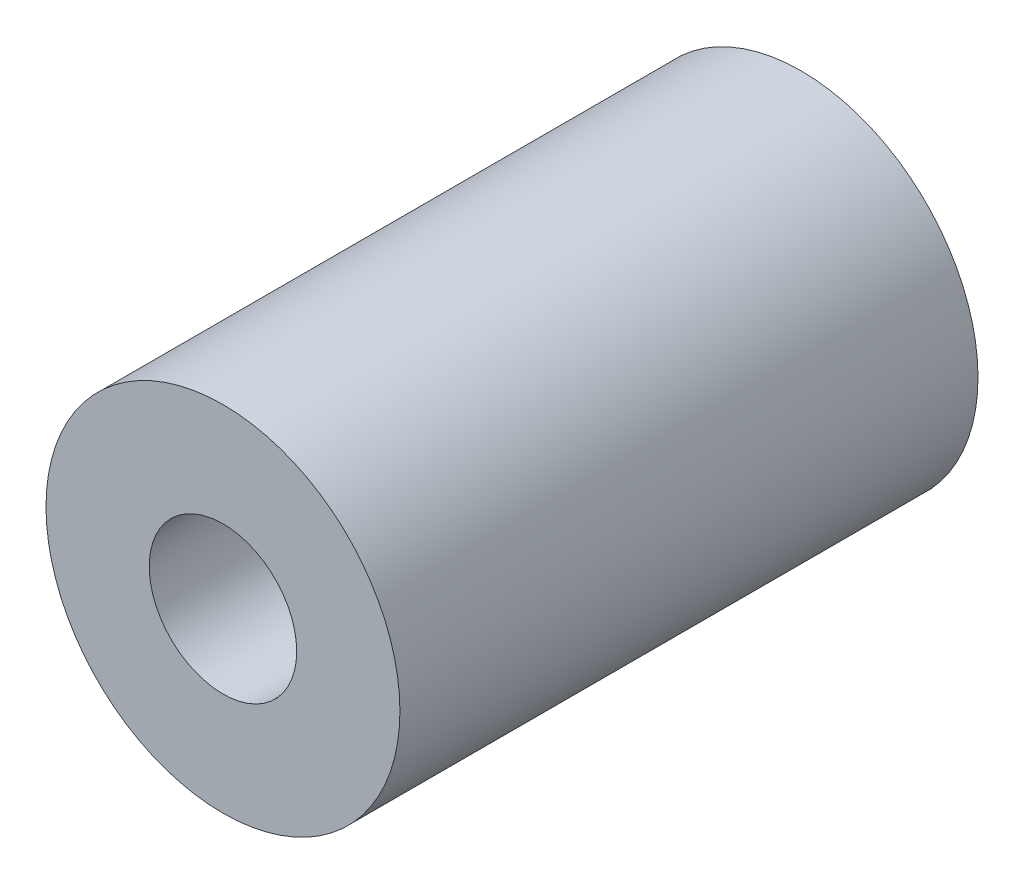
ISO-10303-21;
HEADER;
FILE_DESCRIPTION(('STEP AP214'),'2;1');
FILE_NAME('part.step','',(''),(''),'','','');
FILE_SCHEMA(('AUTOMOTIVE_DESIGN { 1 0 10303 214 1 1 1 1 }'));
ENDSEC;
DATA;
#1=APPLICATION_CONTEXT('core data for automotive mechanical design processes');
#2=APPLICATION_PROTOCOL_DEFINITION('international standard','automotive_design',2000,#1);
#3=PRODUCT_CONTEXT('',#1,'mechanical');
#4=PRODUCT('Part','Part','',(#3));
#5=PRODUCT_RELATED_PRODUCT_CATEGORY('part','',(#4));
#6=PRODUCT_DEFINITION_FORMATION('','',#4);
#7=PRODUCT_DEFINITION_CONTEXT('part definition',#1,'design');
#8=PRODUCT_DEFINITION('design','',#6,#7);
#9=PRODUCT_DEFINITION_SHAPE('','',#8);
#10=(LENGTH_UNIT() NAMED_UNIT(*) SI_UNIT(.MILLI.,.METRE.));
#11=(NAMED_UNIT(*) PLANE_ANGLE_UNIT() SI_UNIT($,.RADIAN.));
#12=(NAMED_UNIT(*) SI_UNIT($,.STERADIAN.) SOLID_ANGLE_UNIT());
#13=UNCERTAINTY_MEASURE_WITH_UNIT(LENGTH_MEASURE(1.E-05),#10,'distance_accuracy_value','');
#14=(GEOMETRIC_REPRESENTATION_CONTEXT(3) GLOBAL_UNCERTAINTY_ASSIGNED_CONTEXT((#13)) GLOBAL_UNIT_ASSIGNED_CONTEXT((#10,
#11,#12)) REPRESENTATION_CONTEXT('',''));
#15=CARTESIAN_POINT('',(0.,0.,0.));
#16=DIRECTION('',(0.,0.,1.));
#17=DIRECTION('',(1.,0.,0.));
#18=AXIS2_PLACEMENT_3D('',#15,#16,#17);
#19=CARTESIAN_POINT('',(0.,0.,98.));
#20=DIRECTION('',(0.,0.,-1.));
#21=DIRECTION('',(-1.,0.,0.));
#22=AXIS2_PLACEMENT_3D('',#19,#20,#21);
#23=CYLINDRICAL_SURFACE('',#22,30.);
#24=CARTESIAN_POINT('',(0.,0.,98.));
#25=DIRECTION('',(0.,0.,1.));
#26=DIRECTION('',(1.,0.,0.));
#27=AXIS2_PLACEMENT_3D('',#24,#25,#26);
#28=CIRCLE('',#27,30.);
#29=CARTESIAN_POINT('',(30.,0.,98.));
#30=VERTEX_POINT('',#29);
#31=EDGE_CURVE('E10',#30,#30,#28,.T.);
#32=ORIENTED_EDGE('',*,*,#31,.F.);
#33=EDGE_LOOP('',(#32));
#34=FACE_BOUND('',#33,.T.);
#35=CARTESIAN_POINT('',(0.,0.,0.));
#36=DIRECTION('',(0.,0.,1.));
#37=DIRECTION('',(1.,0.,0.));
#38=AXIS2_PLACEMENT_3D('',#35,#36,#37);
#39=CIRCLE('',#38,30.);
#40=CARTESIAN_POINT('',(30.,0.,0.));
#41=VERTEX_POINT('',#40);
#42=EDGE_CURVE('E44',#41,#41,#39,.T.);
#43=ORIENTED_EDGE('',*,*,#42,.T.);
#44=EDGE_LOOP('',(#43));
#45=FACE_BOUND('',#44,.T.);
#46=ADVANCED_FACE('F41',(#34,#45),#23,.T.);
#47=CARTESIAN_POINT('',(0.,0.,98.));
#48=DIRECTION('',(0.,0.,1.));
#49=DIRECTION('',(1.,0.,0.));
#50=AXIS2_PLACEMENT_3D('',#47,#48,#49);
#51=PLANE('',#50);
#52=CARTESIAN_POINT('',(0.,0.,98.));
#53=DIRECTION('',(0.,0.,1.));
#54=DIRECTION('',(1.,0.,0.));
#55=AXIS2_PLACEMENT_3D('',#52,#53,#54);
#56=CIRCLE('',#55,12.5);
#57=CARTESIAN_POINT('',(12.5,0.,98.));
#58=VERTEX_POINT('',#57);
#59=EDGE_CURVE('E55',#58,#58,#56,.T.);
#60=ORIENTED_EDGE('',*,*,#59,.F.);
#61=EDGE_LOOP('',(#60));
#62=FACE_BOUND('',#61,.T.);
#63=ORIENTED_EDGE('',*,*,#31,.T.);
#64=EDGE_LOOP('',(#63));
#65=FACE_BOUND('',#64,.T.);
#66=ADVANCED_FACE('F84',(#62,#65),#51,.T.);
#67=CARTESIAN_POINT('',(0.,0.,0.));
#68=DIRECTION('',(0.,0.,1.));
#69=DIRECTION('',(1.,0.,0.));
#70=AXIS2_PLACEMENT_3D('',#67,#68,#69);
#71=PLANE('',#70);
#72=CARTESIAN_POINT('',(0.,0.,0.));
#73=DIRECTION('',(0.,0.,-1.));
#74=DIRECTION('',(-1.,0.,0.));
#75=AXIS2_PLACEMENT_3D('',#72,#73,#74);
#76=CIRCLE('',#75,17.5);
#77=CARTESIAN_POINT('',(-17.5,0.,0.));
#78=VERTEX_POINT('',#77);
#79=EDGE_CURVE('E63',#78,#78,#76,.T.);
#80=ORIENTED_EDGE('',*,*,#79,.F.);
#81=EDGE_LOOP('',(#80));
#82=FACE_BOUND('',#81,.T.);
#83=ORIENTED_EDGE('',*,*,#42,.F.);
#84=EDGE_LOOP('',(#83));
#85=FACE_BOUND('',#84,.T.);
#86=ADVANCED_FACE('F80',(#82,#85),#71,.F.);
#87=CARTESIAN_POINT('',(0.,0.,66.));
#88=DIRECTION('',(0.,0.,1.));
#89=DIRECTION('',(1.,0.,0.));
#90=AXIS2_PLACEMENT_3D('',#87,#88,#89);
#91=CYLINDRICAL_SURFACE('',#90,12.5);
#92=CARTESIAN_POINT('',(0.,0.,66.));
#93=DIRECTION('',(0.,0.,1.));
#94=DIRECTION('',(1.,0.,0.));
#95=AXIS2_PLACEMENT_3D('',#92,#93,#94);
#96=CIRCLE('',#95,12.5);
#97=CARTESIAN_POINT('',(12.5,0.,66.));
#98=VERTEX_POINT('',#97);
#99=EDGE_CURVE('E53',#98,#98,#96,.T.);
#100=ORIENTED_EDGE('',*,*,#99,.F.);
#101=EDGE_LOOP('',(#100));
#102=FACE_BOUND('',#101,.T.);
#103=ORIENTED_EDGE('',*,*,#59,.T.);
#104=EDGE_LOOP('',(#103));
#105=FACE_BOUND('',#104,.T.);
#106=ADVANCED_FACE('F83',(#102,#105),#91,.F.);
#107=CARTESIAN_POINT('',(0.,0.,66.));
#108=DIRECTION('',(0.,0.,1.));
#109=DIRECTION('',(1.,0.,0.));
#110=AXIS2_PLACEMENT_3D('',#107,#108,#109);
#111=PLANE('',#110);
#112=ORIENTED_EDGE('',*,*,#99,.T.);
#113=EDGE_LOOP('',(#112));
#114=FACE_BOUND('',#113,.T.);
#115=ADVANCED_FACE('F76',(#114),#111,.T.);
#116=CARTESIAN_POINT('',(0.,0.,30.));
#117=DIRECTION('',(0.,0.,-1.));
#118=DIRECTION('',(-1.,0.,0.));
#119=AXIS2_PLACEMENT_3D('',#116,#117,#118);
#120=CYLINDRICAL_SURFACE('',#119,17.5);
#121=CARTESIAN_POINT('',(0.,0.,30.));
#122=DIRECTION('',(0.,0.,-1.));
#123=DIRECTION('',(-1.,0.,0.));
#124=AXIS2_PLACEMENT_3D('',#121,#122,#123);
#125=CIRCLE('',#124,17.5);
#126=CARTESIAN_POINT('',(-17.5,0.,30.));
#127=VERTEX_POINT('',#126);
#128=EDGE_CURVE('E59',#127,#127,#125,.T.);
#129=ORIENTED_EDGE('',*,*,#128,.F.);
#130=EDGE_LOOP('',(#129));
#131=FACE_BOUND('',#130,.T.);
#132=ORIENTED_EDGE('',*,*,#79,.T.);
#133=EDGE_LOOP('',(#132));
#134=FACE_BOUND('',#133,.T.);
#135=ADVANCED_FACE('F73',(#131,#134),#120,.F.);
#136=CARTESIAN_POINT('',(0.,0.,30.));
#137=DIRECTION('',(0.,0.,-1.));
#138=DIRECTION('',(-1.,0.,0.));
#139=AXIS2_PLACEMENT_3D('',#136,#137,#138);
#140=PLANE('',#139);
#141=ORIENTED_EDGE('',*,*,#128,.T.);
#142=EDGE_LOOP('',(#141));
#143=FACE_BOUND('',#142,.T.);
#144=ADVANCED_FACE('F71',(#143),#140,.T.);
#145=CLOSED_SHELL('',(#46,#66,#86,#106,#115,#135,#144));
#146=MANIFOLD_SOLID_BREP('B2',#145);
#147=ADVANCED_BREP_SHAPE_REPRESENTATION('',(#18,#146),#14);
#148=SHAPE_DEFINITION_REPRESENTATION(#9,#147);
ENDSEC;
END-ISO-10303-21;
